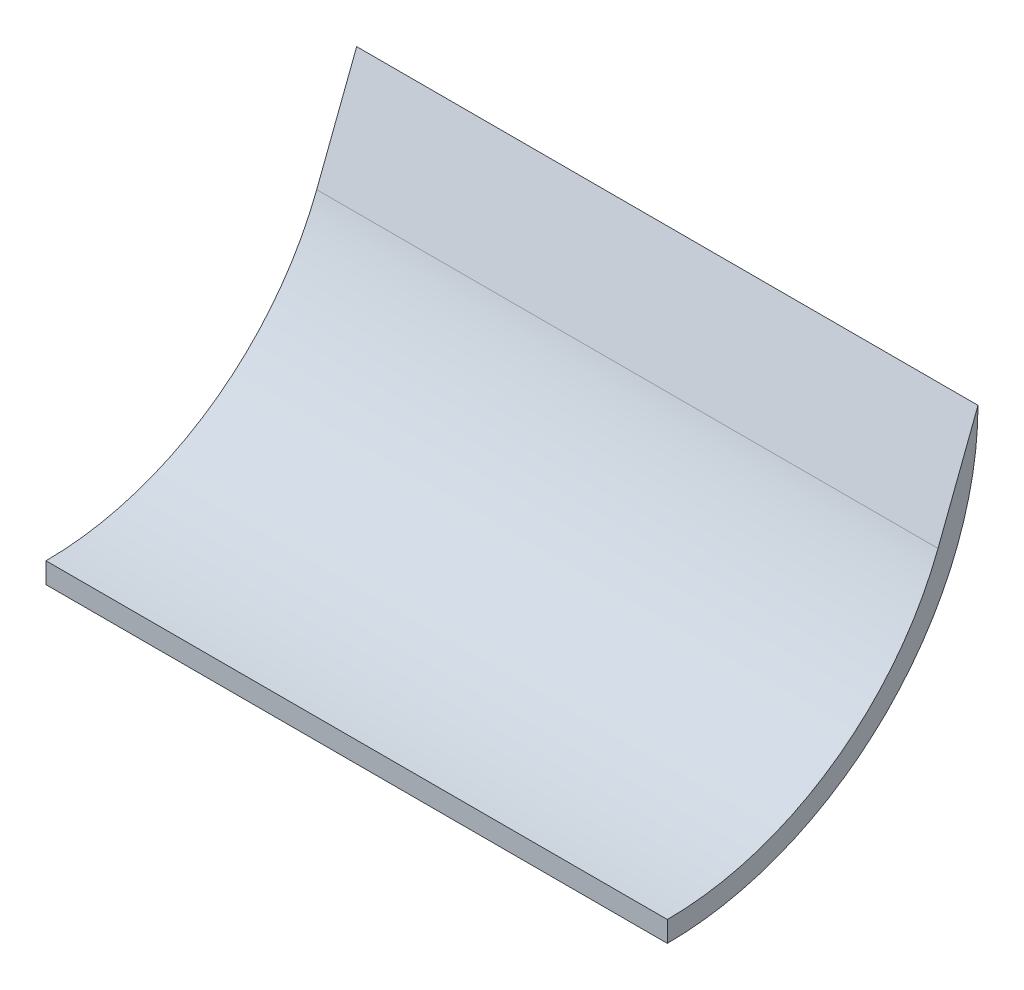
ISO-10303-21;
HEADER;
FILE_DESCRIPTION(('STEP AP214'),'2;1');
FILE_NAME('part.step','',(''),(''),'','','');
FILE_SCHEMA(('AUTOMOTIVE_DESIGN { 1 0 10303 214 1 1 1 1 }'));
ENDSEC;
DATA;
#1=APPLICATION_CONTEXT('core data for automotive mechanical design processes');
#2=APPLICATION_PROTOCOL_DEFINITION('international standard','automotive_design',2000,#1);
#3=PRODUCT_CONTEXT('',#1,'mechanical');
#4=PRODUCT('Part','Part','',(#3));
#5=PRODUCT_RELATED_PRODUCT_CATEGORY('part','',(#4));
#6=PRODUCT_DEFINITION_FORMATION('','',#4);
#7=PRODUCT_DEFINITION_CONTEXT('part definition',#1,'design');
#8=PRODUCT_DEFINITION('design','',#6,#7);
#9=PRODUCT_DEFINITION_SHAPE('','',#8);
#10=(LENGTH_UNIT() NAMED_UNIT(*) SI_UNIT(.MILLI.,.METRE.));
#11=(NAMED_UNIT(*) PLANE_ANGLE_UNIT() SI_UNIT($,.RADIAN.));
#12=(NAMED_UNIT(*) SI_UNIT($,.STERADIAN.) SOLID_ANGLE_UNIT());
#13=UNCERTAINTY_MEASURE_WITH_UNIT(LENGTH_MEASURE(1.E-05),#10,'distance_accuracy_value','');
#14=(GEOMETRIC_REPRESENTATION_CONTEXT(3) GLOBAL_UNCERTAINTY_ASSIGNED_CONTEXT((#13)) GLOBAL_UNIT_ASSIGNED_CONTEXT((#10,
#11,#12)) REPRESENTATION_CONTEXT('',''));
#15=CARTESIAN_POINT('',(0.,0.,0.));
#16=DIRECTION('',(0.,0.,1.));
#17=DIRECTION('',(1.,0.,0.));
#18=AXIS2_PLACEMENT_3D('',#15,#16,#17);
#19=CARTESIAN_POINT('',(45.,45.,45.));
#20=DIRECTION('',(-1.,0.,0.));
#21=DIRECTION('',(0.,0.,1.));
#22=AXIS2_PLACEMENT_3D('',#19,#20,#21);
#23=CYLINDRICAL_SURFACE('',#22,45.);
#24=CARTESIAN_POINT('',(45.,45.,45.));
#25=DIRECTION('',(1.,0.,0.));
#26=DIRECTION('',(0.,0.,-1.));
#27=AXIS2_PLACEMENT_3D('',#24,#25,#26);
#28=CIRCLE('',#27,45.);
#29=CARTESIAN_POINT('',(45.,0.,45.));
#30=VERTEX_POINT('',#29);
#31=CARTESIAN_POINT('',(45.,45.,0.));
#32=VERTEX_POINT('',#31);
#33=EDGE_CURVE('E96',#30,#32,#28,.T.);
#34=ORIENTED_EDGE('',*,*,#33,.F.);
#35=DIRECTION('',(1.,0.,0.));
#36=VECTOR('',#35,1.);
#37=CARTESIAN_POINT('',(-45.,0.,45.));
#38=LINE('',#37,#36);
#39=CARTESIAN_POINT('',(-45.,0.,45.));
#40=VERTEX_POINT('',#39);
#41=EDGE_CURVE('E81',#40,#30,#38,.T.);
#42=ORIENTED_EDGE('',*,*,#41,.F.);
#43=CARTESIAN_POINT('',(-45.,45.,45.));
#44=DIRECTION('',(1.,0.,0.));
#45=DIRECTION('',(0.,0.,-1.));
#46=AXIS2_PLACEMENT_3D('',#43,#44,#45);
#47=CIRCLE('',#46,45.);
#48=CARTESIAN_POINT('',(-45.,45.,0.));
#49=VERTEX_POINT('',#48);
#50=EDGE_CURVE('E98',#40,#49,#47,.T.);
#51=ORIENTED_EDGE('',*,*,#50,.T.);
#52=DIRECTION('',(1.,0.,0.));
#53=VECTOR('',#52,1.);
#54=CARTESIAN_POINT('',(-45.,45.,0.));
#55=LINE('',#54,#53);
#56=EDGE_CURVE('E88',#49,#32,#55,.T.);
#57=ORIENTED_EDGE('',*,*,#56,.T.);
#58=EDGE_LOOP('',(#34,#42,#51,#57));
#59=FACE_BOUND('',#58,.T.);
#60=ADVANCED_FACE('F39',(#59),#23,.T.);
#61=CARTESIAN_POINT('',(45.,45.,45.));
#62=DIRECTION('',(1.,0.,0.));
#63=DIRECTION('',(0.,0.,-1.));
#64=AXIS2_PLACEMENT_3D('',#61,#62,#63);
#65=PLANE('',#64);
#66=DIRECTION('',(0.,1.,0.));
#67=VECTOR('',#66,1.);
#68=CARTESIAN_POINT('',(45.,45.,45.));
#69=LINE('',#68,#67);
#70=CARTESIAN_POINT('',(45.,2.99999999999999,45.));
#71=VERTEX_POINT('',#70);
#72=EDGE_CURVE('E58',#30,#71,#69,.T.);
#73=ORIENTED_EDGE('',*,*,#72,.F.);
#74=ORIENTED_EDGE('',*,*,#33,.T.);
#75=DIRECTION('',(0.,0.933333098702864,-0.359011597118687));
#76=VECTOR('',#75,1.);
#77=CARTESIAN_POINT('',(45.,45.,0.));
#78=LINE('',#77,#76);
#79=CARTESIAN_POINT('',(45.,29.9493122278628,5.78932801410257));
#80=VERTEX_POINT('',#79);
#81=EDGE_CURVE('E42',#80,#32,#78,.T.);
#82=ORIENTED_EDGE('',*,*,#81,.F.);
#83=CARTESIAN_POINT('',(45.,45.,45.));
#84=DIRECTION('',(1.,0.,0.));
#85=DIRECTION('',(0.,0.,-1.));
#86=AXIS2_PLACEMENT_3D('',#83,#84,#85);
#87=CIRCLE('',#86,42.);
#88=EDGE_CURVE('E74',#71,#80,#87,.T.);
#89=ORIENTED_EDGE('',*,*,#88,.F.);
#90=EDGE_LOOP('',(#73,#74,#82,#89));
#91=FACE_BOUND('',#90,.T.);
#92=ADVANCED_FACE('F101',(#91),#65,.T.);
#93=CARTESIAN_POINT('',(-45.,45.,45.));
#94=DIRECTION('',(1.,0.,0.));
#95=DIRECTION('',(0.,0.,-1.));
#96=AXIS2_PLACEMENT_3D('',#93,#94,#95);
#97=PLANE('',#96);
#98=ORIENTED_EDGE('',*,*,#50,.F.);
#99=DIRECTION('',(0.,1.,0.));
#100=VECTOR('',#99,1.);
#101=CARTESIAN_POINT('',(-45.,45.,45.));
#102=LINE('',#101,#100);
#103=CARTESIAN_POINT('',(-45.,3.00000000000002,45.));
#104=VERTEX_POINT('',#103);
#105=EDGE_CURVE('E78',#40,#104,#102,.T.);
#106=ORIENTED_EDGE('',*,*,#105,.T.);
#107=CARTESIAN_POINT('',(-45.,45.,45.));
#108=DIRECTION('',(1.,0.,0.));
#109=DIRECTION('',(0.,0.,-1.));
#110=AXIS2_PLACEMENT_3D('',#107,#108,#109);
#111=CIRCLE('',#110,42.);
#112=CARTESIAN_POINT('',(-45.,29.9493122278679,5.78932801410062));
#113=VERTEX_POINT('',#112);
#114=EDGE_CURVE('E107',#104,#113,#111,.T.);
#115=ORIENTED_EDGE('',*,*,#114,.T.);
#116=DIRECTION('',(0.,0.933333098702864,-0.359011597118687));
#117=VECTOR('',#116,1.);
#118=CARTESIAN_POINT('',(-45.,29.9493122278764,5.78932801409734));
#119=LINE('',#118,#117);
#120=EDGE_CURVE('E110',#113,#49,#119,.T.);
#121=ORIENTED_EDGE('',*,*,#120,.T.);
#122=EDGE_LOOP('',(#98,#106,#115,#121));
#123=FACE_BOUND('',#122,.T.);
#124=ADVANCED_FACE('F133',(#123),#97,.F.);
#125=CARTESIAN_POINT('',(-45.,45.,45.));
#126=DIRECTION('',(1.,0.,0.));
#127=DIRECTION('',(0.,0.,-1.));
#128=AXIS2_PLACEMENT_3D('',#125,#126,#127);
#129=CYLINDRICAL_SURFACE('',#128,42.);
#130=ORIENTED_EDGE('',*,*,#88,.T.);
#131=DIRECTION('',(1.,0.,0.));
#132=VECTOR('',#131,1.);
#133=CARTESIAN_POINT('',(-45.,29.9493122278764,5.78932801409735));
#134=LINE('',#133,#132);
#135=EDGE_CURVE('E49',#80,#113,#134,.F.);
#136=ORIENTED_EDGE('',*,*,#135,.T.);
#137=ORIENTED_EDGE('',*,*,#114,.F.);
#138=DIRECTION('',(1.,0.,0.));
#139=VECTOR('',#138,1.);
#140=CARTESIAN_POINT('',(-45.,3.,45.));
#141=LINE('',#140,#139);
#142=EDGE_CURVE('E11',#104,#71,#141,.T.);
#143=ORIENTED_EDGE('',*,*,#142,.T.);
#144=EDGE_LOOP('',(#130,#136,#137,#143));
#145=FACE_BOUND('',#144,.T.);
#146=ADVANCED_FACE('F134',(#145),#129,.F.);
#147=CARTESIAN_POINT('',(-45.,45.,0.));
#148=DIRECTION('',(0.,-0.359011597118687,-0.933333098702864));
#149=DIRECTION('',(0.,0.933333098702864,-0.359011597118687));
#150=AXIS2_PLACEMENT_3D('',#147,#148,#149);
#151=PLANE('',#150);
#152=ORIENTED_EDGE('',*,*,#81,.T.);
#153=ORIENTED_EDGE('',*,*,#56,.F.);
#154=ORIENTED_EDGE('',*,*,#120,.F.);
#155=ORIENTED_EDGE('',*,*,#135,.F.);
#156=EDGE_LOOP('',(#152,#153,#154,#155));
#157=FACE_BOUND('',#156,.T.);
#158=ADVANCED_FACE('F86',(#157),#151,.F.);
#159=CARTESIAN_POINT('',(-45.,45.,45.));
#160=DIRECTION('',(0.,0.,-1.));
#161=DIRECTION('',(-1.,0.,0.));
#162=AXIS2_PLACEMENT_3D('',#159,#160,#161);
#163=PLANE('',#162);
#164=ORIENTED_EDGE('',*,*,#105,.F.);
#165=ORIENTED_EDGE('',*,*,#41,.T.);
#166=ORIENTED_EDGE('',*,*,#72,.T.);
#167=ORIENTED_EDGE('',*,*,#142,.F.);
#168=EDGE_LOOP('',(#164,#165,#166,#167));
#169=FACE_BOUND('',#168,.T.);
#170=ADVANCED_FACE('F141',(#169),#163,.F.);
#171=CLOSED_SHELL('',(#60,#92,#124,#146,#158,#170));
#172=MANIFOLD_SOLID_BREP('B2',#171);
#173=ADVANCED_BREP_SHAPE_REPRESENTATION('',(#18,#172),#14);
#174=SHAPE_DEFINITION_REPRESENTATION(#9,#173);
ENDSEC;
END-ISO-10303-21;
